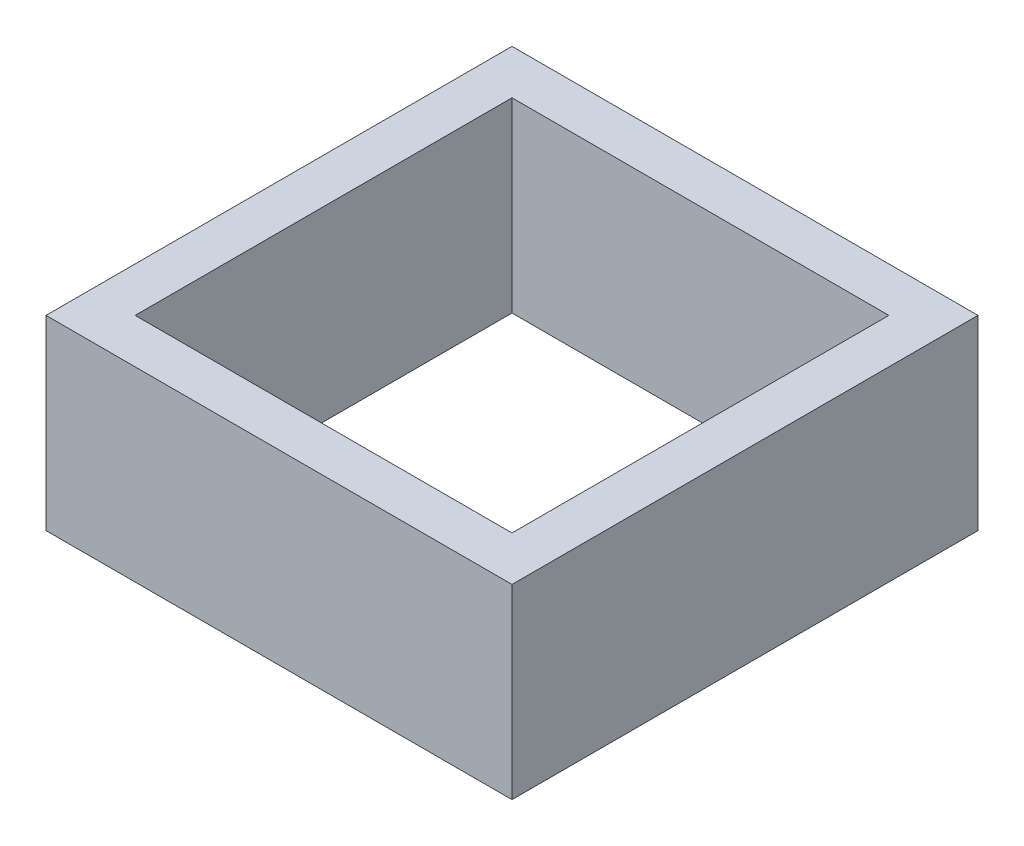
ISO-10303-21;
HEADER;
FILE_DESCRIPTION(('STEP AP214'),'2;1');
FILE_NAME('part.step','',(''),(''),'','','');
FILE_SCHEMA(('AUTOMOTIVE_DESIGN { 1 0 10303 214 1 1 1 1 }'));
ENDSEC;
DATA;
#1=APPLICATION_CONTEXT('core data for automotive mechanical design processes');
#2=APPLICATION_PROTOCOL_DEFINITION('international standard','automotive_design',2000,#1);
#3=PRODUCT_CONTEXT('',#1,'mechanical');
#4=PRODUCT('Part','Part','',(#3));
#5=PRODUCT_RELATED_PRODUCT_CATEGORY('part','',(#4));
#6=PRODUCT_DEFINITION_FORMATION('','',#4);
#7=PRODUCT_DEFINITION_CONTEXT('part definition',#1,'design');
#8=PRODUCT_DEFINITION('design','',#6,#7);
#9=PRODUCT_DEFINITION_SHAPE('','',#8);
#10=(LENGTH_UNIT() NAMED_UNIT(*) SI_UNIT(.MILLI.,.METRE.));
#11=(NAMED_UNIT(*) PLANE_ANGLE_UNIT() SI_UNIT($,.RADIAN.));
#12=(NAMED_UNIT(*) SI_UNIT($,.STERADIAN.) SOLID_ANGLE_UNIT());
#13=UNCERTAINTY_MEASURE_WITH_UNIT(LENGTH_MEASURE(1.E-05),#10,'distance_accuracy_value','');
#14=(GEOMETRIC_REPRESENTATION_CONTEXT(3) GLOBAL_UNCERTAINTY_ASSIGNED_CONTEXT((#13)) GLOBAL_UNIT_ASSIGNED_CONTEXT((#10,
#11,#12)) REPRESENTATION_CONTEXT('',''));
#15=CARTESIAN_POINT('',(0.,0.,0.));
#16=DIRECTION('',(0.,0.,1.));
#17=DIRECTION('',(1.,0.,0.));
#18=AXIS2_PLACEMENT_3D('',#15,#16,#17);
#19=CARTESIAN_POINT('',(0.,92.,0.));
#20=DIRECTION('',(0.,1.,0.));
#21=DIRECTION('',(0.,0.,1.));
#22=AXIS2_PLACEMENT_3D('',#19,#20,#21);
#23=PLANE('',#22);
#24=DIRECTION('',(0.,0.,1.));
#25=VECTOR('',#24,1.);
#26=CARTESIAN_POINT('',(-115.,92.,-115.));
#27=LINE('',#26,#25);
#28=CARTESIAN_POINT('',(-115.,92.,-115.));
#29=VERTEX_POINT('',#28);
#30=CARTESIAN_POINT('',(-115.,92.,115.));
#31=VERTEX_POINT('',#30);
#32=EDGE_CURVE('E134',#29,#31,#27,.T.);
#33=ORIENTED_EDGE('',*,*,#32,.T.);
#34=DIRECTION('',(1.,0.,0.));
#35=VECTOR('',#34,1.);
#36=CARTESIAN_POINT('',(-115.,92.,115.));
#37=LINE('',#36,#35);
#38=CARTESIAN_POINT('',(115.,92.,115.));
#39=VERTEX_POINT('',#38);
#40=EDGE_CURVE('E137',#31,#39,#37,.T.);
#41=ORIENTED_EDGE('',*,*,#40,.T.);
#42=DIRECTION('',(0.,0.,-1.));
#43=VECTOR('',#42,1.);
#44=CARTESIAN_POINT('',(115.,92.,-115.));
#45=LINE('',#44,#43);
#46=CARTESIAN_POINT('',(115.,92.,-115.));
#47=VERTEX_POINT('',#46);
#48=EDGE_CURVE('E140',#39,#47,#45,.T.);
#49=ORIENTED_EDGE('',*,*,#48,.T.);
#50=DIRECTION('',(-1.,0.,0.));
#51=VECTOR('',#50,1.);
#52=CARTESIAN_POINT('',(-115.,92.,-115.));
#53=LINE('',#52,#51);
#54=EDGE_CURVE('E142',#47,#29,#53,.T.);
#55=ORIENTED_EDGE('',*,*,#54,.T.);
#56=EDGE_LOOP('',(#33,#41,#49,#55));
#57=FACE_BOUND('',#56,.T.);
#58=DIRECTION('',(1.,0.,0.));
#59=VECTOR('',#58,1.);
#60=CARTESIAN_POINT('',(-93.,92.,93.));
#61=LINE('',#60,#59);
#62=CARTESIAN_POINT('',(-93.,92.,93.));
#63=VERTEX_POINT('',#62);
#64=CARTESIAN_POINT('',(93.,92.,93.));
#65=VERTEX_POINT('',#64);
#66=EDGE_CURVE('E106',#63,#65,#61,.T.);
#67=ORIENTED_EDGE('',*,*,#66,.F.);
#68=DIRECTION('',(0.,0.,1.));
#69=VECTOR('',#68,1.);
#70=CARTESIAN_POINT('',(-93.,92.,-93.));
#71=LINE('',#70,#69);
#72=CARTESIAN_POINT('',(-93.,92.,-93.));
#73=VERTEX_POINT('',#72);
#74=EDGE_CURVE('E98',#73,#63,#71,.T.);
#75=ORIENTED_EDGE('',*,*,#74,.F.);
#76=DIRECTION('',(-1.,0.,0.));
#77=VECTOR('',#76,1.);
#78=CARTESIAN_POINT('',(-93.,92.,-93.));
#79=LINE('',#78,#77);
#80=CARTESIAN_POINT('',(93.,92.,-93.));
#81=VERTEX_POINT('',#80);
#82=EDGE_CURVE('E120',#81,#73,#79,.T.);
#83=ORIENTED_EDGE('',*,*,#82,.F.);
#84=DIRECTION('',(0.,0.,-1.));
#85=VECTOR('',#84,1.);
#86=CARTESIAN_POINT('',(93.,92.,-93.));
#87=LINE('',#86,#85);
#88=EDGE_CURVE('E118',#65,#81,#87,.T.);
#89=ORIENTED_EDGE('',*,*,#88,.F.);
#90=EDGE_LOOP('',(#67,#75,#83,#89));
#91=FACE_BOUND('',#90,.T.);
#92=ADVANCED_FACE('F33',(#57,#91),#23,.T.);
#93=CARTESIAN_POINT('',(0.,0.,0.));
#94=DIRECTION('',(0.,1.,0.));
#95=DIRECTION('',(0.,0.,1.));
#96=AXIS2_PLACEMENT_3D('',#93,#94,#95);
#97=PLANE('',#96);
#98=DIRECTION('',(0.,0.,1.));
#99=VECTOR('',#98,1.);
#100=CARTESIAN_POINT('',(-115.,0.,-115.));
#101=LINE('',#100,#99);
#102=CARTESIAN_POINT('',(-115.,0.,-115.));
#103=VERTEX_POINT('',#102);
#104=CARTESIAN_POINT('',(-115.,0.,115.));
#105=VERTEX_POINT('',#104);
#106=EDGE_CURVE('E114',#103,#105,#101,.T.);
#107=ORIENTED_EDGE('',*,*,#106,.F.);
#108=DIRECTION('',(-1.,0.,0.));
#109=VECTOR('',#108,1.);
#110=CARTESIAN_POINT('',(-115.,0.,-115.));
#111=LINE('',#110,#109);
#112=CARTESIAN_POINT('',(115.,0.,-115.));
#113=VERTEX_POINT('',#112);
#114=EDGE_CURVE('E138',#113,#103,#111,.T.);
#115=ORIENTED_EDGE('',*,*,#114,.F.);
#116=DIRECTION('',(0.,0.,-1.));
#117=VECTOR('',#116,1.);
#118=CARTESIAN_POINT('',(115.,0.,-115.));
#119=LINE('',#118,#117);
#120=CARTESIAN_POINT('',(115.,0.,115.));
#121=VERTEX_POINT('',#120);
#122=EDGE_CURVE('E149',#121,#113,#119,.T.);
#123=ORIENTED_EDGE('',*,*,#122,.F.);
#124=DIRECTION('',(1.,0.,0.));
#125=VECTOR('',#124,1.);
#126=CARTESIAN_POINT('',(-115.,0.,115.));
#127=LINE('',#126,#125);
#128=EDGE_CURVE('E147',#105,#121,#127,.T.);
#129=ORIENTED_EDGE('',*,*,#128,.F.);
#130=EDGE_LOOP('',(#107,#115,#123,#129));
#131=FACE_BOUND('',#130,.T.);
#132=DIRECTION('',(0.,0.,1.));
#133=VECTOR('',#132,1.);
#134=CARTESIAN_POINT('',(-93.,0.,-93.));
#135=LINE('',#134,#133);
#136=CARTESIAN_POINT('',(-93.,0.,-93.));
#137=VERTEX_POINT('',#136);
#138=CARTESIAN_POINT('',(-93.,0.,93.));
#139=VERTEX_POINT('',#138);
#140=EDGE_CURVE('E56',#137,#139,#135,.T.);
#141=ORIENTED_EDGE('',*,*,#140,.T.);
#142=DIRECTION('',(1.,0.,0.));
#143=VECTOR('',#142,1.);
#144=CARTESIAN_POINT('',(-93.,0.,93.));
#145=LINE('',#144,#143);
#146=CARTESIAN_POINT('',(93.,0.,93.));
#147=VERTEX_POINT('',#146);
#148=EDGE_CURVE('E113',#139,#147,#145,.T.);
#149=ORIENTED_EDGE('',*,*,#148,.T.);
#150=DIRECTION('',(0.,0.,-1.));
#151=VECTOR('',#150,1.);
#152=CARTESIAN_POINT('',(93.,0.,-93.));
#153=LINE('',#152,#151);
#154=CARTESIAN_POINT('',(93.,0.,-93.));
#155=VERTEX_POINT('',#154);
#156=EDGE_CURVE('E126',#147,#155,#153,.T.);
#157=ORIENTED_EDGE('',*,*,#156,.T.);
#158=DIRECTION('',(-1.,0.,0.));
#159=VECTOR('',#158,1.);
#160=CARTESIAN_POINT('',(-93.,0.,-93.));
#161=LINE('',#160,#159);
#162=EDGE_CURVE('E107',#155,#137,#161,.T.);
#163=ORIENTED_EDGE('',*,*,#162,.T.);
#164=EDGE_LOOP('',(#141,#149,#157,#163));
#165=FACE_BOUND('',#164,.T.);
#166=ADVANCED_FACE('F167',(#131,#165),#97,.F.);
#167=CARTESIAN_POINT('',(-115.,92.,-115.));
#168=DIRECTION('',(1.,0.,0.));
#169=DIRECTION('',(0.,0.,-1.));
#170=AXIS2_PLACEMENT_3D('',#167,#168,#169);
#171=PLANE('',#170);
#172=ORIENTED_EDGE('',*,*,#106,.T.);
#173=DIRECTION('',(0.,-1.,0.));
#174=VECTOR('',#173,1.);
#175=CARTESIAN_POINT('',(-115.,92.,115.));
#176=LINE('',#175,#174);
#177=EDGE_CURVE('E11',#31,#105,#176,.T.);
#178=ORIENTED_EDGE('',*,*,#177,.F.);
#179=ORIENTED_EDGE('',*,*,#32,.F.);
#180=DIRECTION('',(0.,-1.,0.));
#181=VECTOR('',#180,1.);
#182=CARTESIAN_POINT('',(-115.,92.,-115.));
#183=LINE('',#182,#181);
#184=EDGE_CURVE('E144',#29,#103,#183,.T.);
#185=ORIENTED_EDGE('',*,*,#184,.T.);
#186=EDGE_LOOP('',(#172,#178,#179,#185));
#187=FACE_BOUND('',#186,.T.);
#188=ADVANCED_FACE('F35',(#187),#171,.F.);
#189=CARTESIAN_POINT('',(-115.,92.,115.));
#190=DIRECTION('',(0.,0.,-1.));
#191=DIRECTION('',(-1.,0.,0.));
#192=AXIS2_PLACEMENT_3D('',#189,#190,#191);
#193=PLANE('',#192);
#194=ORIENTED_EDGE('',*,*,#128,.T.);
#195=DIRECTION('',(0.,-1.,0.));
#196=VECTOR('',#195,1.);
#197=CARTESIAN_POINT('',(115.,92.,115.));
#198=LINE('',#197,#196);
#199=EDGE_CURVE('E41',#39,#121,#198,.T.);
#200=ORIENTED_EDGE('',*,*,#199,.F.);
#201=ORIENTED_EDGE('',*,*,#40,.F.);
#202=ORIENTED_EDGE('',*,*,#177,.T.);
#203=EDGE_LOOP('',(#194,#200,#201,#202));
#204=FACE_BOUND('',#203,.T.);
#205=ADVANCED_FACE('F177',(#204),#193,.F.);
#206=CARTESIAN_POINT('',(115.,92.,-115.));
#207=DIRECTION('',(-1.,0.,0.));
#208=DIRECTION('',(0.,0.,1.));
#209=AXIS2_PLACEMENT_3D('',#206,#207,#208);
#210=PLANE('',#209);
#211=ORIENTED_EDGE('',*,*,#122,.T.);
#212=DIRECTION('',(0.,-1.,0.));
#213=VECTOR('',#212,1.);
#214=CARTESIAN_POINT('',(115.,92.,-115.));
#215=LINE('',#214,#213);
#216=EDGE_CURVE('E154',#47,#113,#215,.T.);
#217=ORIENTED_EDGE('',*,*,#216,.F.);
#218=ORIENTED_EDGE('',*,*,#48,.F.);
#219=ORIENTED_EDGE('',*,*,#199,.T.);
#220=EDGE_LOOP('',(#211,#217,#218,#219));
#221=FACE_BOUND('',#220,.T.);
#222=ADVANCED_FACE('F161',(#221),#210,.F.);
#223=CARTESIAN_POINT('',(-115.,92.,-115.));
#224=DIRECTION('',(0.,0.,1.));
#225=DIRECTION('',(1.,0.,0.));
#226=AXIS2_PLACEMENT_3D('',#223,#224,#225);
#227=PLANE('',#226);
#228=ORIENTED_EDGE('',*,*,#114,.T.);
#229=ORIENTED_EDGE('',*,*,#184,.F.);
#230=ORIENTED_EDGE('',*,*,#54,.F.);
#231=ORIENTED_EDGE('',*,*,#216,.T.);
#232=EDGE_LOOP('',(#228,#229,#230,#231));
#233=FACE_BOUND('',#232,.T.);
#234=ADVANCED_FACE('F171',(#233),#227,.F.);
#235=CARTESIAN_POINT('',(-93.,92.,-93.));
#236=DIRECTION('',(1.,0.,0.));
#237=DIRECTION('',(0.,0.,-1.));
#238=AXIS2_PLACEMENT_3D('',#235,#236,#237);
#239=PLANE('',#238);
#240=ORIENTED_EDGE('',*,*,#140,.F.);
#241=DIRECTION('',(0.,-1.,0.));
#242=VECTOR('',#241,1.);
#243=CARTESIAN_POINT('',(-93.,92.,-93.));
#244=LINE('',#243,#242);
#245=EDGE_CURVE('E102',#73,#137,#244,.T.);
#246=ORIENTED_EDGE('',*,*,#245,.F.);
#247=ORIENTED_EDGE('',*,*,#74,.T.);
#248=DIRECTION('',(0.,-1.,0.));
#249=VECTOR('',#248,1.);
#250=CARTESIAN_POINT('',(-93.,92.,93.));
#251=LINE('',#250,#249);
#252=EDGE_CURVE('E101',#63,#139,#251,.T.);
#253=ORIENTED_EDGE('',*,*,#252,.T.);
#254=EDGE_LOOP('',(#240,#246,#247,#253));
#255=FACE_BOUND('',#254,.T.);
#256=ADVANCED_FACE('F100',(#255),#239,.T.);
#257=CARTESIAN_POINT('',(-93.,92.,93.));
#258=DIRECTION('',(0.,0.,-1.));
#259=DIRECTION('',(-1.,0.,0.));
#260=AXIS2_PLACEMENT_3D('',#257,#258,#259);
#261=PLANE('',#260);
#262=ORIENTED_EDGE('',*,*,#148,.F.);
#263=ORIENTED_EDGE('',*,*,#252,.F.);
#264=ORIENTED_EDGE('',*,*,#66,.T.);
#265=DIRECTION('',(0.,-1.,0.));
#266=VECTOR('',#265,1.);
#267=CARTESIAN_POINT('',(93.,92.,93.));
#268=LINE('',#267,#266);
#269=EDGE_CURVE('E115',#65,#147,#268,.T.);
#270=ORIENTED_EDGE('',*,*,#269,.T.);
#271=EDGE_LOOP('',(#262,#263,#264,#270));
#272=FACE_BOUND('',#271,.T.);
#273=ADVANCED_FACE('F110',(#272),#261,.T.);
#274=CARTESIAN_POINT('',(93.,92.,-93.));
#275=DIRECTION('',(-1.,0.,0.));
#276=DIRECTION('',(0.,0.,1.));
#277=AXIS2_PLACEMENT_3D('',#274,#275,#276);
#278=PLANE('',#277);
#279=ORIENTED_EDGE('',*,*,#156,.F.);
#280=ORIENTED_EDGE('',*,*,#269,.F.);
#281=ORIENTED_EDGE('',*,*,#88,.T.);
#282=DIRECTION('',(0.,-1.,0.));
#283=VECTOR('',#282,1.);
#284=CARTESIAN_POINT('',(93.,92.,-93.));
#285=LINE('',#284,#283);
#286=EDGE_CURVE('E48',#81,#155,#285,.T.);
#287=ORIENTED_EDGE('',*,*,#286,.T.);
#288=EDGE_LOOP('',(#279,#280,#281,#287));
#289=FACE_BOUND('',#288,.T.);
#290=ADVANCED_FACE('F200',(#289),#278,.T.);
#291=CARTESIAN_POINT('',(-93.,92.,-93.));
#292=DIRECTION('',(0.,0.,1.));
#293=DIRECTION('',(1.,0.,0.));
#294=AXIS2_PLACEMENT_3D('',#291,#292,#293);
#295=PLANE('',#294);
#296=ORIENTED_EDGE('',*,*,#162,.F.);
#297=ORIENTED_EDGE('',*,*,#286,.F.);
#298=ORIENTED_EDGE('',*,*,#82,.T.);
#299=ORIENTED_EDGE('',*,*,#245,.T.);
#300=EDGE_LOOP('',(#296,#297,#298,#299));
#301=FACE_BOUND('',#300,.T.);
#302=ADVANCED_FACE('F204',(#301),#295,.T.);
#303=CLOSED_SHELL('',(#92,#166,#188,#205,#222,#234,#256,#273,#290,#302));
#304=MANIFOLD_SOLID_BREP('B2',#303);
#305=ADVANCED_BREP_SHAPE_REPRESENTATION('',(#18,#304),#14);
#306=SHAPE_DEFINITION_REPRESENTATION(#9,#305);
ENDSEC;
END-ISO-10303-21;
